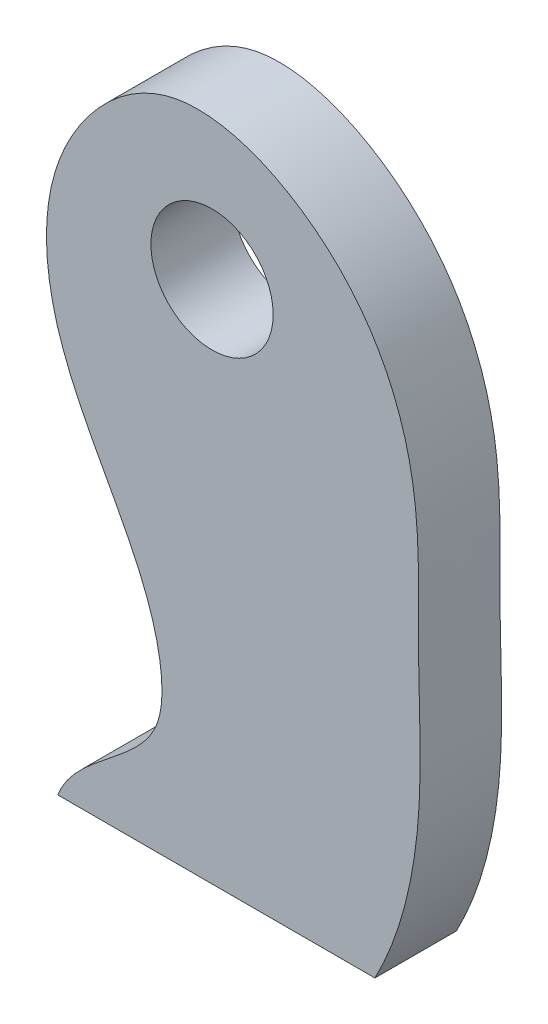
ISO-10303-21;
HEADER;
FILE_DESCRIPTION(('STEP AP214'),'2;1');
FILE_NAME('part.step','',(''),(''),'','','');
FILE_SCHEMA(('AUTOMOTIVE_DESIGN { 1 0 10303 214 1 1 1 1 }'));
ENDSEC;
DATA;
#1=APPLICATION_CONTEXT('core data for automotive mechanical design processes');
#2=APPLICATION_PROTOCOL_DEFINITION('international standard','automotive_design',2000,#1);
#3=PRODUCT_CONTEXT('',#1,'mechanical');
#4=PRODUCT('Part','Part','',(#3));
#5=PRODUCT_RELATED_PRODUCT_CATEGORY('part','',(#4));
#6=PRODUCT_DEFINITION_FORMATION('','',#4);
#7=PRODUCT_DEFINITION_CONTEXT('part definition',#1,'design');
#8=PRODUCT_DEFINITION('design','',#6,#7);
#9=PRODUCT_DEFINITION_SHAPE('','',#8);
#10=(LENGTH_UNIT() NAMED_UNIT(*) SI_UNIT(.MILLI.,.METRE.));
#11=(NAMED_UNIT(*) PLANE_ANGLE_UNIT() SI_UNIT($,.RADIAN.));
#12=(NAMED_UNIT(*) SI_UNIT($,.STERADIAN.) SOLID_ANGLE_UNIT());
#13=UNCERTAINTY_MEASURE_WITH_UNIT(LENGTH_MEASURE(1.E-05),#10,'distance_accuracy_value','');
#14=(GEOMETRIC_REPRESENTATION_CONTEXT(3) GLOBAL_UNCERTAINTY_ASSIGNED_CONTEXT((#13)) GLOBAL_UNIT_ASSIGNED_CONTEXT((#10,
#11,#12)) REPRESENTATION_CONTEXT('',''));
#15=CARTESIAN_POINT('',(0.,0.,0.));
#16=DIRECTION('',(0.,0.,1.));
#17=DIRECTION('',(1.,0.,0.));
#18=AXIS2_PLACEMENT_3D('',#15,#16,#17);
#19=CARTESIAN_POINT('',(88.7832955688353,58.8967931273184,3.175));
#20=DIRECTION('',(0.,0.,1.));
#21=DIRECTION('',(1.,0.,0.));
#22=AXIS2_PLACEMENT_3D('',#19,#20,#21);
#23=PLANE('',#22);
#24=CARTESIAN_POINT('',(96.1069094325103,33.0545863196066,3.175));
#25=CARTESIAN_POINT('',(97.1378283235678,35.0066638008223,3.175));
#26=CARTESIAN_POINT('',(98.0793361990238,39.0499707980532,3.175));
#27=CARTESIAN_POINT('',(97.7018645545913,44.9421653009136,3.175));
#28=CARTESIAN_POINT('',(97.9885750470929,50.8466933584249,3.175));
#29=CARTESIAN_POINT('',(95.3714669307882,56.929577856843,3.175));
#30=CARTESIAN_POINT('',(88.0145462464652,60.4547156471145,3.175));
#31=CARTESIAN_POINT('',(82.9952750311091,54.6910169158047,3.175));
#32=CARTESIAN_POINT('',(83.3371508620725,48.3738124013728,3.175));
#33=CARTESIAN_POINT('',(86.2242593911617,43.9472960413071,3.175));
#34=CARTESIAN_POINT('',(87.8098577431306,40.2008838313637,3.175));
#35=CARTESIAN_POINT('',(87.9294071516489,35.9472599388524,3.175));
#36=CARTESIAN_POINT('',(84.4286808631425,34.8540491159875,3.175));
#37=CARTESIAN_POINT('',(83.7569191994683,33.0545863196066,3.175));
#38=B_SPLINE_CURVE_WITH_KNOTS('',3,(#24,#25,#26,#27,#28,#29,#30,#31,#32,#33,#34,#35,#36,#37),
.UNSPECIFIED.,.F.,.F.,(4,1,1,1,1,1,1,1,1,1,1,4),(0.,0.108123028307763,0.19904217141215,
0.290037017396517,0.395425083561009,0.512262205315906,0.613297148772592,0.704216291876979,
0.807125069475347,0.868159217169636,0.905315429859977,1.),.UNSPECIFIED.);
#39=CARTESIAN_POINT('',(96.1069094325103,33.0545863196066,3.175));
#40=VERTEX_POINT('',#39);
#41=CARTESIAN_POINT('',(83.7569191994683,33.0545863196066,3.175));
#42=VERTEX_POINT('',#41);
#43=EDGE_CURVE('E65',#40,#42,#38,.T.);
#44=ORIENTED_EDGE('',*,*,#43,.T.);
#45=DIRECTION('',(1.,0.,0.));
#46=VECTOR('',#45,1.);
#47=CARTESIAN_POINT('',(83.7569191994683,33.0545863196066,3.175));
#48=LINE('',#47,#46);
#49=EDGE_CURVE('E50',#42,#40,#48,.T.);
#50=ORIENTED_EDGE('',*,*,#49,.T.);
#51=EDGE_LOOP('',(#44,#50));
#52=FACE_BOUND('',#51,.T.);
#53=CARTESIAN_POINT('',(89.7619603219567,53.4490656035291,3.175));
#54=DIRECTION('',(0.,0.,1.));
#55=DIRECTION('',(1.,0.,0.));
#56=AXIS2_PLACEMENT_3D('',#53,#54,#55);
#57=CIRCLE('',#56,2.38125);
#58=CARTESIAN_POINT('',(92.1432103219567,53.4490656035291,3.175));
#59=VERTEX_POINT('',#58);
#60=EDGE_CURVE('E71',#59,#59,#57,.T.);
#61=ORIENTED_EDGE('',*,*,#60,.F.);
#62=EDGE_LOOP('',(#61));
#63=FACE_BOUND('',#62,.T.);
#64=ADVANCED_FACE('F33',(#52,#63),#23,.T.);
#65=CARTESIAN_POINT('',(88.7832955688353,58.8967931273184,0.));
#66=DIRECTION('',(0.,0.,1.));
#67=DIRECTION('',(1.,0.,0.));
#68=AXIS2_PLACEMENT_3D('',#65,#66,#67);
#69=PLANE('',#68);
#70=CARTESIAN_POINT('',(96.1069094325103,33.0545863196066,0.));
#71=CARTESIAN_POINT('',(97.1378283235678,35.0066638008223,0.));
#72=CARTESIAN_POINT('',(98.0793361990238,39.0499707980532,0.));
#73=CARTESIAN_POINT('',(97.7018645545913,44.9421653009136,0.));
#74=CARTESIAN_POINT('',(97.9885750470929,50.8466933584249,0.));
#75=CARTESIAN_POINT('',(95.3714669307882,56.929577856843,0.));
#76=CARTESIAN_POINT('',(88.0145462464652,60.4547156471145,0.));
#77=CARTESIAN_POINT('',(82.9952750311091,54.6910169158047,0.));
#78=CARTESIAN_POINT('',(83.3371508620725,48.3738124013728,0.));
#79=CARTESIAN_POINT('',(86.2242593911617,43.9472960413071,0.));
#80=CARTESIAN_POINT('',(87.8098577431306,40.2008838313637,0.));
#81=CARTESIAN_POINT('',(87.9294071516489,35.9472599388524,0.));
#82=CARTESIAN_POINT('',(84.4286808631425,34.8540491159875,0.));
#83=CARTESIAN_POINT('',(83.7569191994683,33.0545863196066,0.));
#84=B_SPLINE_CURVE_WITH_KNOTS('',3,(#70,#71,#72,#73,#74,#75,#76,#77,#78,#79,#80,#81,#82,#83),
.UNSPECIFIED.,.F.,.F.,(4,1,1,1,1,1,1,1,1,1,1,4),(0.,0.108123028307763,0.19904217141215,
0.290037017396517,0.395425083561009,0.512262205315906,0.613297148772592,0.704216291876979,
0.807125069475347,0.868159217169636,0.905315429859977,1.),.UNSPECIFIED.);
#85=CARTESIAN_POINT('',(96.1069094325103,33.0545863196066,0.));
#86=VERTEX_POINT('',#85);
#87=CARTESIAN_POINT('',(83.7569191994683,33.0545863196066,0.));
#88=VERTEX_POINT('',#87);
#89=EDGE_CURVE('E66',#86,#88,#84,.T.);
#90=ORIENTED_EDGE('',*,*,#89,.F.);
#91=DIRECTION('',(1.,0.,0.));
#92=VECTOR('',#91,1.);
#93=CARTESIAN_POINT('',(83.7569191994683,33.0545863196066,0.));
#94=LINE('',#93,#92);
#95=EDGE_CURVE('E58',#88,#86,#94,.T.);
#96=ORIENTED_EDGE('',*,*,#95,.F.);
#97=EDGE_LOOP('',(#90,#96));
#98=FACE_BOUND('',#97,.T.);
#99=CARTESIAN_POINT('',(89.7619603219567,53.4490656035291,0.));
#100=DIRECTION('',(0.,0.,1.));
#101=DIRECTION('',(1.,0.,0.));
#102=AXIS2_PLACEMENT_3D('',#99,#100,#101);
#103=CIRCLE('',#102,2.38125);
#104=CARTESIAN_POINT('',(92.1432103219567,53.4490656035291,0.));
#105=VERTEX_POINT('',#104);
#106=EDGE_CURVE('E74',#105,#105,#103,.T.);
#107=ORIENTED_EDGE('',*,*,#106,.T.);
#108=EDGE_LOOP('',(#107));
#109=FACE_BOUND('',#108,.T.);
#110=ADVANCED_FACE('F69',(#98,#109),#69,.F.);
#111=DIRECTION('',(0.,0.,-1.));
#112=VECTOR('',#111,1.);
#113=SURFACE_OF_LINEAR_EXTRUSION('',#38,#112);
#114=ORIENTED_EDGE('',*,*,#89,.T.);
#115=DIRECTION('',(0.,0.,-1.));
#116=VECTOR('',#115,1.);
#117=CARTESIAN_POINT('',(83.7569191994683,33.0545863196066,3.175));
#118=LINE('',#117,#116);
#119=EDGE_CURVE('E11',#42,#88,#118,.T.);
#120=ORIENTED_EDGE('',*,*,#119,.F.);
#121=ORIENTED_EDGE('',*,*,#43,.F.);
#122=DIRECTION('',(0.,0.,-1.));
#123=VECTOR('',#122,1.);
#124=CARTESIAN_POINT('',(96.1069094325103,33.0545863196066,3.175));
#125=LINE('',#124,#123);
#126=EDGE_CURVE('E43',#40,#86,#125,.T.);
#127=ORIENTED_EDGE('',*,*,#126,.T.);
#128=EDGE_LOOP('',(#114,#120,#121,#127));
#129=FACE_BOUND('',#128,.T.);
#130=ADVANCED_FACE('F35',(#129),#113,.F.);
#131=CARTESIAN_POINT('',(83.7569191994683,33.0545863196066,3.175));
#132=DIRECTION('',(0.,1.,0.));
#133=DIRECTION('',(0.,0.,1.));
#134=AXIS2_PLACEMENT_3D('',#131,#132,#133);
#135=PLANE('',#134);
#136=ORIENTED_EDGE('',*,*,#95,.T.);
#137=ORIENTED_EDGE('',*,*,#126,.F.);
#138=ORIENTED_EDGE('',*,*,#49,.F.);
#139=ORIENTED_EDGE('',*,*,#119,.T.);
#140=EDGE_LOOP('',(#136,#137,#138,#139));
#141=FACE_BOUND('',#140,.T.);
#142=ADVANCED_FACE('F61',(#141),#135,.F.);
#143=CARTESIAN_POINT('',(89.7619603219567,53.4490656035291,3.175));
#144=DIRECTION('',(0.,0.,-1.));
#145=DIRECTION('',(-1.,0.,0.));
#146=AXIS2_PLACEMENT_3D('',#143,#144,#145);
#147=CYLINDRICAL_SURFACE('',#146,2.38125);
#148=ORIENTED_EDGE('',*,*,#60,.T.);
#149=EDGE_LOOP('',(#148));
#150=FACE_BOUND('',#149,.T.);
#151=ORIENTED_EDGE('',*,*,#106,.F.);
#152=EDGE_LOOP('',(#151));
#153=FACE_BOUND('',#152,.T.);
#154=ADVANCED_FACE('F92',(#150,#153),#147,.F.);
#155=CLOSED_SHELL('',(#64,#110,#130,#142,#154));
#156=MANIFOLD_SOLID_BREP('B2',#155);
#157=ADVANCED_BREP_SHAPE_REPRESENTATION('',(#18,#156),#14);
#158=SHAPE_DEFINITION_REPRESENTATION(#9,#157);
ENDSEC;
END-ISO-10303-21;
